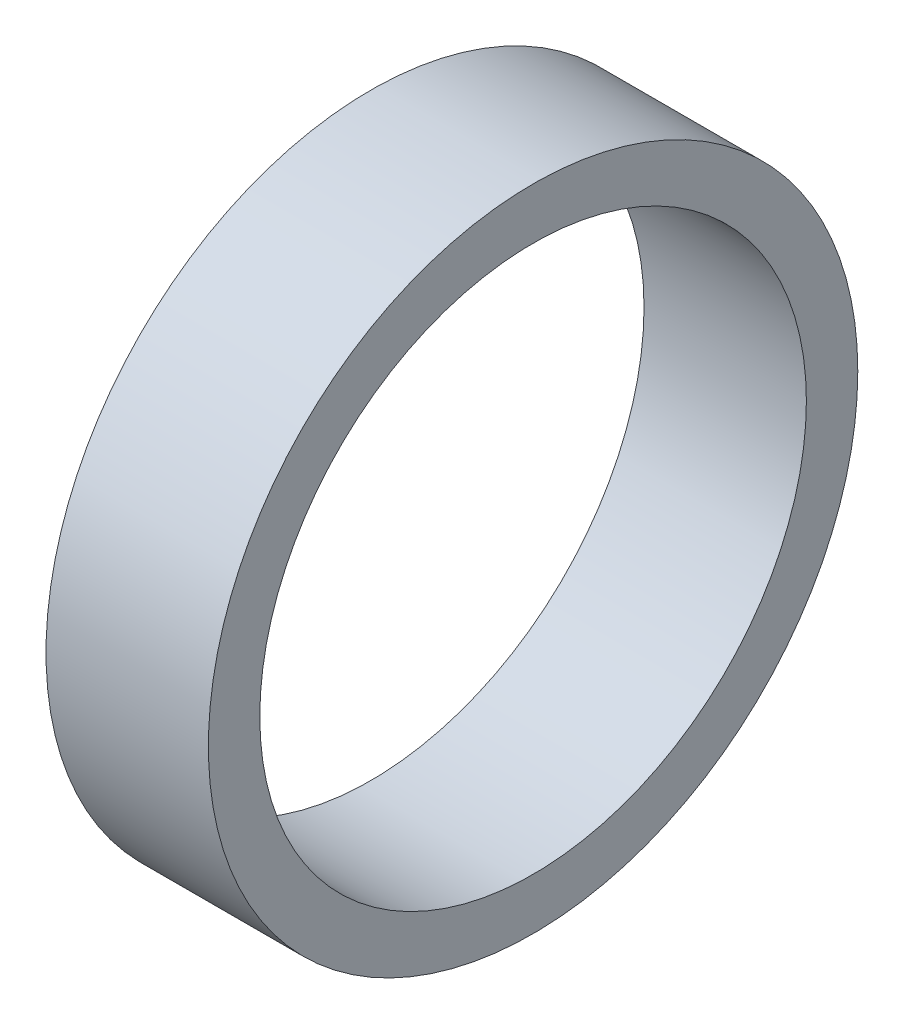
ISO-10303-21;
HEADER;
FILE_DESCRIPTION(('STEP AP214'),'2;1');
FILE_NAME('part.step','',(''),(''),'','','');
FILE_SCHEMA(('AUTOMOTIVE_DESIGN { 1 0 10303 214 1 1 1 1 }'));
ENDSEC;
DATA;
#1=APPLICATION_CONTEXT('core data for automotive mechanical design processes');
#2=APPLICATION_PROTOCOL_DEFINITION('international standard','automotive_design',2000,#1);
#3=PRODUCT_CONTEXT('',#1,'mechanical');
#4=PRODUCT('Part','Part','',(#3));
#5=PRODUCT_RELATED_PRODUCT_CATEGORY('part','',(#4));
#6=PRODUCT_DEFINITION_FORMATION('','',#4);
#7=PRODUCT_DEFINITION_CONTEXT('part definition',#1,'design');
#8=PRODUCT_DEFINITION('design','',#6,#7);
#9=PRODUCT_DEFINITION_SHAPE('','',#8);
#10=(LENGTH_UNIT() NAMED_UNIT(*) SI_UNIT(.MILLI.,.METRE.));
#11=(NAMED_UNIT(*) PLANE_ANGLE_UNIT() SI_UNIT($,.RADIAN.));
#12=(NAMED_UNIT(*) SI_UNIT($,.STERADIAN.) SOLID_ANGLE_UNIT());
#13=UNCERTAINTY_MEASURE_WITH_UNIT(LENGTH_MEASURE(1.E-05),#10,'distance_accuracy_value','');
#14=(GEOMETRIC_REPRESENTATION_CONTEXT(3) GLOBAL_UNCERTAINTY_ASSIGNED_CONTEXT((#13)) GLOBAL_UNIT_ASSIGNED_CONTEXT((#10,
#11,#12)) REPRESENTATION_CONTEXT('',''));
#15=CARTESIAN_POINT('',(0.,0.,0.));
#16=DIRECTION('',(0.,0.,1.));
#17=DIRECTION('',(1.,0.,0.));
#18=AXIS2_PLACEMENT_3D('',#15,#16,#17);
#19=CARTESIAN_POINT('',(30.,0.,0.));
#20=DIRECTION('',(1.,0.,0.));
#21=DIRECTION('',(0.,0.,-1.));
#22=AXIS2_PLACEMENT_3D('',#19,#20,#21);
#23=PLANE('',#22);
#24=CARTESIAN_POINT('',(30.,0.,0.));
#25=DIRECTION('',(1.,0.,0.));
#26=DIRECTION('',(0.,0.,-1.));
#27=AXIS2_PLACEMENT_3D('',#24,#25,#26);
#28=CIRCLE('',#27,60.);
#29=CARTESIAN_POINT('',(30.,0.,-60.));
#30=VERTEX_POINT('',#29);
#31=EDGE_CURVE('E12',#30,#30,#28,.T.);
#32=ORIENTED_EDGE('',*,*,#31,.T.);
#33=EDGE_LOOP('',(#32));
#34=FACE_BOUND('',#33,.T.);
#35=CARTESIAN_POINT('',(30.,0.,0.));
#36=DIRECTION('',(1.,0.,0.));
#37=DIRECTION('',(0.,0.,-1.));
#38=AXIS2_PLACEMENT_3D('',#35,#36,#37);
#39=CIRCLE('',#38,50.5);
#40=CARTESIAN_POINT('',(30.,0.,-50.5));
#41=VERTEX_POINT('',#40);
#42=EDGE_CURVE('E58',#41,#41,#39,.T.);
#43=ORIENTED_EDGE('',*,*,#42,.F.);
#44=EDGE_LOOP('',(#43));
#45=FACE_BOUND('',#44,.T.);
#46=ADVANCED_FACE('F47',(#34,#45),#23,.T.);
#47=CARTESIAN_POINT('',(0.,0.,0.));
#48=DIRECTION('',(1.,0.,0.));
#49=DIRECTION('',(0.,0.,-1.));
#50=AXIS2_PLACEMENT_3D('',#47,#48,#49);
#51=PLANE('',#50);
#52=CARTESIAN_POINT('',(0.,0.,0.));
#53=DIRECTION('',(1.,0.,0.));
#54=DIRECTION('',(0.,0.,-1.));
#55=AXIS2_PLACEMENT_3D('',#52,#53,#54);
#56=CIRCLE('',#55,60.);
#57=CARTESIAN_POINT('',(0.,0.,-60.));
#58=VERTEX_POINT('',#57);
#59=EDGE_CURVE('E51',#58,#58,#56,.T.);
#60=ORIENTED_EDGE('',*,*,#59,.F.);
#61=EDGE_LOOP('',(#60));
#62=FACE_BOUND('',#61,.T.);
#63=CARTESIAN_POINT('',(0.,0.,0.));
#64=DIRECTION('',(1.,0.,0.));
#65=DIRECTION('',(0.,0.,-1.));
#66=AXIS2_PLACEMENT_3D('',#63,#64,#65);
#67=CIRCLE('',#66,50.5);
#68=CARTESIAN_POINT('',(0.,0.,-50.5));
#69=VERTEX_POINT('',#68);
#70=EDGE_CURVE('E60',#69,#69,#67,.T.);
#71=ORIENTED_EDGE('',*,*,#70,.T.);
#72=EDGE_LOOP('',(#71));
#73=FACE_BOUND('',#72,.T.);
#74=ADVANCED_FACE('F70',(#62,#73),#51,.F.);
#75=CARTESIAN_POINT('',(30.,0.,0.));
#76=DIRECTION('',(-1.,0.,0.));
#77=DIRECTION('',(0.,0.,1.));
#78=AXIS2_PLACEMENT_3D('',#75,#76,#77);
#79=CYLINDRICAL_SURFACE('',#78,60.);
#80=ORIENTED_EDGE('',*,*,#31,.F.);
#81=EDGE_LOOP('',(#80));
#82=FACE_BOUND('',#81,.T.);
#83=ORIENTED_EDGE('',*,*,#59,.T.);
#84=EDGE_LOOP('',(#83));
#85=FACE_BOUND('',#84,.T.);
#86=ADVANCED_FACE('F49',(#82,#85),#79,.T.);
#87=CARTESIAN_POINT('',(30.,0.,0.));
#88=DIRECTION('',(-1.,0.,0.));
#89=DIRECTION('',(0.,0.,1.));
#90=AXIS2_PLACEMENT_3D('',#87,#88,#89);
#91=CYLINDRICAL_SURFACE('',#90,50.5);
#92=ORIENTED_EDGE('',*,*,#42,.T.);
#93=EDGE_LOOP('',(#92));
#94=FACE_BOUND('',#93,.T.);
#95=ORIENTED_EDGE('',*,*,#70,.F.);
#96=EDGE_LOOP('',(#95));
#97=FACE_BOUND('',#96,.T.);
#98=ADVANCED_FACE('F66',(#94,#97),#91,.F.);
#99=CLOSED_SHELL('',(#46,#74,#86,#98));
#100=MANIFOLD_SOLID_BREP('B2',#99);
#101=ADVANCED_BREP_SHAPE_REPRESENTATION('',(#18,#100),#14);
#102=SHAPE_DEFINITION_REPRESENTATION(#9,#101);
ENDSEC;
END-ISO-10303-21;
